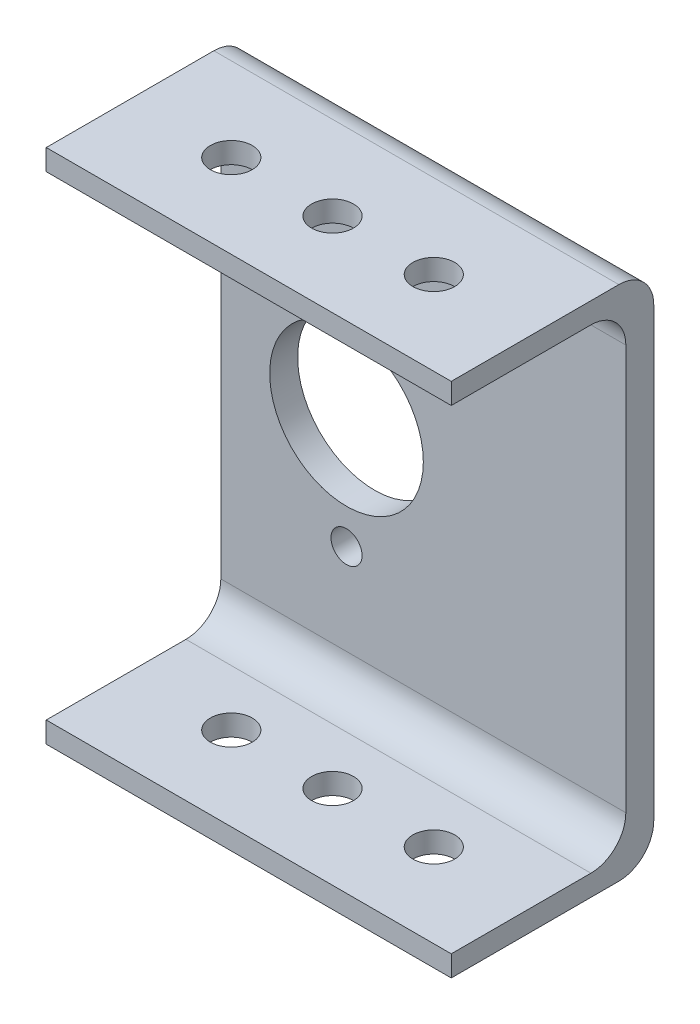
ISO-10303-21;
HEADER;
FILE_DESCRIPTION(('STEP AP214'),'2;1');
FILE_NAME('part.step','',(''),(''),'','','');
FILE_SCHEMA(('AUTOMOTIVE_DESIGN { 1 0 10303 214 1 1 1 1 }'));
ENDSEC;
DATA;
#1=APPLICATION_CONTEXT('core data for automotive mechanical design processes');
#2=APPLICATION_PROTOCOL_DEFINITION('international standard','automotive_design',2000,#1);
#3=PRODUCT_CONTEXT('',#1,'mechanical');
#4=PRODUCT('Part','Part','',(#3));
#5=PRODUCT_RELATED_PRODUCT_CATEGORY('part','',(#4));
#6=PRODUCT_DEFINITION_FORMATION('','',#4);
#7=PRODUCT_DEFINITION_CONTEXT('part definition',#1,'design');
#8=PRODUCT_DEFINITION('design','',#6,#7);
#9=PRODUCT_DEFINITION_SHAPE('','',#8);
#10=(LENGTH_UNIT() NAMED_UNIT(*) SI_UNIT(.MILLI.,.METRE.));
#11=(NAMED_UNIT(*) PLANE_ANGLE_UNIT() SI_UNIT($,.RADIAN.));
#12=(NAMED_UNIT(*) SI_UNIT($,.STERADIAN.) SOLID_ANGLE_UNIT());
#13=UNCERTAINTY_MEASURE_WITH_UNIT(LENGTH_MEASURE(1.E-05),#10,'distance_accuracy_value','');
#14=(GEOMETRIC_REPRESENTATION_CONTEXT(3) GLOBAL_UNCERTAINTY_ASSIGNED_CONTEXT((#13)) GLOBAL_UNIT_ASSIGNED_CONTEXT((#10,
#11,#12)) REPRESENTATION_CONTEXT('',''));
#15=CARTESIAN_POINT('',(0.,0.,0.));
#16=DIRECTION('',(0.,0.,1.));
#17=DIRECTION('',(1.,0.,0.));
#18=AXIS2_PLACEMENT_3D('',#15,#16,#17);
#19=CARTESIAN_POINT('',(0.,0.,4.));
#20=DIRECTION('',(0.,0.,-1.));
#21=DIRECTION('',(-1.,0.,0.));
#22=AXIS2_PLACEMENT_3D('',#19,#20,#21);
#23=PLANE('',#22);
#24=CARTESIAN_POINT('',(-1.00000000000013,-15.9999999999998,4.));
#25=DIRECTION('',(0.,0.,-1.));
#26=DIRECTION('',(-1.,0.,0.));
#27=AXIS2_PLACEMENT_3D('',#24,#25,#26);
#28=CIRCLE('',#27,2.22499999999983);
#29=CARTESIAN_POINT('',(-3.22499999999996,-15.9999999999998,4.));
#30=VERTEX_POINT('',#29);
#31=EDGE_CURVE('E335',#30,#30,#28,.T.);
#32=ORIENTED_EDGE('',*,*,#31,.T.);
#33=EDGE_LOOP('',(#32));
#34=FACE_BOUND('',#33,.T.);
#35=CARTESIAN_POINT('',(-1.0000000000001,16.0000000000002,4.));
#36=DIRECTION('',(0.,0.,-1.));
#37=DIRECTION('',(-1.,0.,0.));
#38=AXIS2_PLACEMENT_3D('',#35,#36,#37);
#39=CIRCLE('',#38,2.22499999999983);
#40=CARTESIAN_POINT('',(-3.22499999999993,16.0000000000002,4.));
#41=VERTEX_POINT('',#40);
#42=EDGE_CURVE('E337',#41,#41,#39,.T.);
#43=ORIENTED_EDGE('',*,*,#42,.T.);
#44=EDGE_LOOP('',(#43));
#45=FACE_BOUND('',#44,.T.);
#46=CARTESIAN_POINT('',(-1.00000000000022,2.22044604925031E-13,4.));
#47=DIRECTION('',(0.,0.,1.));
#48=DIRECTION('',(1.,0.,0.));
#49=AXIS2_PLACEMENT_3D('',#46,#47,#48);
#50=CIRCLE('',#49,11.);
#51=CARTESIAN_POINT('',(9.99999999999977,2.22044604925031E-13,4.));
#52=VERTEX_POINT('',#51);
#53=EDGE_CURVE('E162',#52,#52,#50,.T.);
#54=ORIENTED_EDGE('',*,*,#53,.F.);
#55=EDGE_LOOP('',(#54));
#56=FACE_BOUND('',#55,.T.);
#57=DIRECTION('',(0.,-1.,0.));
#58=VECTOR('',#57,1.);
#59=CARTESIAN_POINT('',(-19.,37.,4.));
#60=LINE('',#59,#58);
#61=CARTESIAN_POINT('',(-19.,29.,4.));
#62=VERTEX_POINT('',#61);
#63=CARTESIAN_POINT('',(-19.,-29.,4.));
#64=VERTEX_POINT('',#63);
#65=EDGE_CURVE('E190',#62,#64,#60,.T.);
#66=ORIENTED_EDGE('',*,*,#65,.T.);
#67=DIRECTION('',(-1.,0.,0.));
#68=VECTOR('',#67,1.);
#69=CARTESIAN_POINT('',(39.,-29.,4.));
#70=LINE('',#69,#68);
#71=CARTESIAN_POINT('',(39.,-29.,4.));
#72=VERTEX_POINT('',#71);
#73=EDGE_CURVE('E213',#64,#72,#70,.F.);
#74=ORIENTED_EDGE('',*,*,#73,.T.);
#75=DIRECTION('',(0.,1.,0.));
#76=VECTOR('',#75,1.);
#77=CARTESIAN_POINT('',(39.,0.,4.));
#78=LINE('',#77,#76);
#79=CARTESIAN_POINT('',(39.,29.,4.));
#80=VERTEX_POINT('',#79);
#81=EDGE_CURVE('E187',#72,#80,#78,.T.);
#82=ORIENTED_EDGE('',*,*,#81,.T.);
#83=DIRECTION('',(1.,0.,0.));
#84=VECTOR('',#83,1.);
#85=CARTESIAN_POINT('',(-19.,29.,4.));
#86=LINE('',#85,#84);
#87=EDGE_CURVE('E211',#80,#62,#86,.F.);
#88=ORIENTED_EDGE('',*,*,#87,.T.);
#89=EDGE_LOOP('',(#66,#74,#82,#88));
#90=FACE_BOUND('',#89,.T.);
#91=ADVANCED_FACE('F39',(#34,#45,#56,#90),#23,.F.);
#92=CARTESIAN_POINT('',(0.,0.,0.));
#93=DIRECTION('',(0.,0.,-1.));
#94=DIRECTION('',(-1.,0.,0.));
#95=AXIS2_PLACEMENT_3D('',#92,#93,#94);
#96=PLANE('',#95);
#97=CARTESIAN_POINT('',(-1.00000000000013,-15.9999999999998,0.));
#98=DIRECTION('',(0.,0.,-1.));
#99=DIRECTION('',(-1.,0.,0.));
#100=AXIS2_PLACEMENT_3D('',#97,#98,#99);
#101=CIRCLE('',#100,2.22499999999983);
#102=CARTESIAN_POINT('',(-3.22499999999996,-15.9999999999998,0.));
#103=VERTEX_POINT('',#102);
#104=EDGE_CURVE('E341',#103,#103,#101,.T.);
#105=ORIENTED_EDGE('',*,*,#104,.F.);
#106=EDGE_LOOP('',(#105));
#107=FACE_BOUND('',#106,.T.);
#108=CARTESIAN_POINT('',(-1.0000000000001,16.0000000000002,0.));
#109=DIRECTION('',(0.,0.,-1.));
#110=DIRECTION('',(-1.,0.,0.));
#111=AXIS2_PLACEMENT_3D('',#108,#109,#110);
#112=CIRCLE('',#111,2.22499999999983);
#113=CARTESIAN_POINT('',(-3.22499999999993,16.0000000000002,0.));
#114=VERTEX_POINT('',#113);
#115=EDGE_CURVE('E419',#114,#114,#112,.T.);
#116=ORIENTED_EDGE('',*,*,#115,.F.);
#117=EDGE_LOOP('',(#116));
#118=FACE_BOUND('',#117,.T.);
#119=DIRECTION('',(0.,-1.,0.));
#120=VECTOR('',#119,1.);
#121=CARTESIAN_POINT('',(-19.,0.,0.));
#122=LINE('',#121,#120);
#123=CARTESIAN_POINT('',(-19.,32.,0.));
#124=VERTEX_POINT('',#123);
#125=CARTESIAN_POINT('',(-19.,-32.,0.));
#126=VERTEX_POINT('',#125);
#127=EDGE_CURVE('E185',#124,#126,#122,.T.);
#128=ORIENTED_EDGE('',*,*,#127,.F.);
#129=DIRECTION('',(-1.,0.,0.));
#130=VECTOR('',#129,1.);
#131=CARTESIAN_POINT('',(39.,32.,0.));
#132=LINE('',#131,#130);
#133=CARTESIAN_POINT('',(39.,32.,0.));
#134=VERTEX_POINT('',#133);
#135=EDGE_CURVE('E64',#124,#134,#132,.F.);
#136=ORIENTED_EDGE('',*,*,#135,.T.);
#137=DIRECTION('',(0.,1.,0.));
#138=VECTOR('',#137,1.);
#139=CARTESIAN_POINT('',(39.,-37.,0.));
#140=LINE('',#139,#138);
#141=CARTESIAN_POINT('',(39.,-32.,0.));
#142=VERTEX_POINT('',#141);
#143=EDGE_CURVE('E191',#142,#134,#140,.T.);
#144=ORIENTED_EDGE('',*,*,#143,.F.);
#145=DIRECTION('',(1.,0.,0.));
#146=VECTOR('',#145,1.);
#147=CARTESIAN_POINT('',(-19.,-32.,0.));
#148=LINE('',#147,#146);
#149=EDGE_CURVE('E224',#142,#126,#148,.F.);
#150=ORIENTED_EDGE('',*,*,#149,.T.);
#151=EDGE_LOOP('',(#128,#136,#144,#150));
#152=FACE_BOUND('',#151,.T.);
#153=CARTESIAN_POINT('',(-1.00000000000022,2.22044604925031E-13,0.));
#154=DIRECTION('',(0.,0.,1.));
#155=DIRECTION('',(1.,0.,0.));
#156=AXIS2_PLACEMENT_3D('',#153,#154,#155);
#157=CIRCLE('',#156,11.);
#158=CARTESIAN_POINT('',(9.99999999999977,2.22044604925031E-13,0.));
#159=VERTEX_POINT('',#158);
#160=EDGE_CURVE('E159',#159,#159,#157,.T.);
#161=ORIENTED_EDGE('',*,*,#160,.T.);
#162=EDGE_LOOP('',(#161));
#163=FACE_BOUND('',#162,.T.);
#164=ADVANCED_FACE('F264',(#107,#118,#152,#163),#96,.T.);
#165=CARTESIAN_POINT('',(-19.,37.,4.));
#166=DIRECTION('',(0.,-1.,0.));
#167=DIRECTION('',(1.,0.,0.));
#168=AXIS2_PLACEMENT_3D('',#165,#166,#167);
#169=PLANE('',#168);
#170=CARTESIAN_POINT('',(24.5,37.,17.));
#171=DIRECTION('',(0.,-1.,0.));
#172=DIRECTION('',(0.,0.,-1.));
#173=AXIS2_PLACEMENT_3D('',#170,#171,#172);
#174=CIRCLE('',#173,3.);
#175=CARTESIAN_POINT('',(24.5,37.,14.));
#176=VERTEX_POINT('',#175);
#177=EDGE_CURVE('E240',#176,#176,#174,.T.);
#178=ORIENTED_EDGE('',*,*,#177,.T.);
#179=EDGE_LOOP('',(#178));
#180=FACE_BOUND('',#179,.T.);
#181=CARTESIAN_POINT('',(-4.50000000000002,37.,17.));
#182=DIRECTION('',(0.,-1.,0.));
#183=DIRECTION('',(0.,0.,-1.));
#184=AXIS2_PLACEMENT_3D('',#181,#182,#183);
#185=CIRCLE('',#184,3.);
#186=CARTESIAN_POINT('',(-4.50000000000002,37.,14.));
#187=VERTEX_POINT('',#186);
#188=EDGE_CURVE('E330',#187,#187,#185,.T.);
#189=ORIENTED_EDGE('',*,*,#188,.T.);
#190=EDGE_LOOP('',(#189));
#191=FACE_BOUND('',#190,.T.);
#192=CARTESIAN_POINT('',(9.99999999999997,37.,17.));
#193=DIRECTION('',(0.,-1.,0.));
#194=DIRECTION('',(0.,0.,-1.));
#195=AXIS2_PLACEMENT_3D('',#192,#193,#194);
#196=CIRCLE('',#195,3.);
#197=CARTESIAN_POINT('',(9.99999999999997,37.,14.));
#198=VERTEX_POINT('',#197);
#199=EDGE_CURVE('E253',#198,#198,#196,.T.);
#200=ORIENTED_EDGE('',*,*,#199,.T.);
#201=EDGE_LOOP('',(#200));
#202=FACE_BOUND('',#201,.T.);
#203=DIRECTION('',(0.,0.,-1.));
#204=VECTOR('',#203,1.);
#205=CARTESIAN_POINT('',(39.,37.,4.));
#206=LINE('',#205,#204);
#207=CARTESIAN_POINT('',(39.,37.,29.));
#208=VERTEX_POINT('',#207);
#209=CARTESIAN_POINT('',(39.,37.,5.));
#210=VERTEX_POINT('',#209);
#211=EDGE_CURVE('E205',#208,#210,#206,.T.);
#212=ORIENTED_EDGE('',*,*,#211,.T.);
#213=DIRECTION('',(-1.,0.,0.));
#214=VECTOR('',#213,1.);
#215=CARTESIAN_POINT('',(-19.,37.,5.));
#216=LINE('',#215,#214);
#217=CARTESIAN_POINT('',(-19.,37.,5.));
#218=VERTEX_POINT('',#217);
#219=EDGE_CURVE('E217',#210,#218,#216,.T.);
#220=ORIENTED_EDGE('',*,*,#219,.T.);
#221=DIRECTION('',(0.,0.,-1.));
#222=VECTOR('',#221,1.);
#223=CARTESIAN_POINT('',(-19.,37.,4.));
#224=LINE('',#223,#222);
#225=CARTESIAN_POINT('',(-19.,37.,29.));
#226=VERTEX_POINT('',#225);
#227=EDGE_CURVE('E203',#226,#218,#224,.T.);
#228=ORIENTED_EDGE('',*,*,#227,.F.);
#229=DIRECTION('',(-1.,0.,0.));
#230=VECTOR('',#229,1.);
#231=CARTESIAN_POINT('',(-19.,37.,29.));
#232=LINE('',#231,#230);
#233=EDGE_CURVE('E151',#208,#226,#232,.T.);
#234=ORIENTED_EDGE('',*,*,#233,.F.);
#235=EDGE_LOOP('',(#212,#220,#228,#234));
#236=FACE_BOUND('',#235,.T.);
#237=ADVANCED_FACE('F260',(#180,#191,#202,#236),#169,.F.);
#238=CARTESIAN_POINT('',(-19.,0.,4.));
#239=DIRECTION('',(1.,0.,0.));
#240=DIRECTION('',(0.,0.,-1.));
#241=AXIS2_PLACEMENT_3D('',#238,#239,#240);
#242=PLANE('',#241);
#243=ORIENTED_EDGE('',*,*,#227,.T.);
#244=CARTESIAN_POINT('',(-19.,32.,5.));
#245=DIRECTION('',(1.,0.,0.));
#246=DIRECTION('',(0.,0.,-1.));
#247=AXIS2_PLACEMENT_3D('',#244,#245,#246);
#248=CIRCLE('',#247,5.);
#249=EDGE_CURVE('E222',#218,#124,#248,.F.);
#250=ORIENTED_EDGE('',*,*,#249,.T.);
#251=ORIENTED_EDGE('',*,*,#127,.T.);
#252=CARTESIAN_POINT('',(-19.,-32.,5.));
#253=DIRECTION('',(1.,0.,0.));
#254=DIRECTION('',(0.,0.,-1.));
#255=AXIS2_PLACEMENT_3D('',#252,#253,#254);
#256=CIRCLE('',#255,5.);
#257=CARTESIAN_POINT('',(-19.,-37.,5.));
#258=VERTEX_POINT('',#257);
#259=EDGE_CURVE('E220',#126,#258,#256,.F.);
#260=ORIENTED_EDGE('',*,*,#259,.T.);
#261=DIRECTION('',(0.,0.,-1.));
#262=VECTOR('',#261,1.);
#263=CARTESIAN_POINT('',(-19.,-37.,4.));
#264=LINE('',#263,#262);
#265=CARTESIAN_POINT('',(-19.,-37.,29.));
#266=VERTEX_POINT('',#265);
#267=EDGE_CURVE('E200',#266,#258,#264,.T.);
#268=ORIENTED_EDGE('',*,*,#267,.F.);
#269=DIRECTION('',(0.,-1.,0.));
#270=VECTOR('',#269,1.);
#271=CARTESIAN_POINT('',(-19.,-37.,29.));
#272=LINE('',#271,#270);
#273=CARTESIAN_POINT('',(-19.,-34.,29.));
#274=VERTEX_POINT('',#273);
#275=EDGE_CURVE('E177',#274,#266,#272,.T.);
#276=ORIENTED_EDGE('',*,*,#275,.F.);
#277=DIRECTION('',(0.,0.,-1.));
#278=VECTOR('',#277,1.);
#279=CARTESIAN_POINT('',(-19.,-34.,29.));
#280=LINE('',#279,#278);
#281=CARTESIAN_POINT('',(-19.,-34.,9.));
#282=VERTEX_POINT('',#281);
#283=EDGE_CURVE('E170',#274,#282,#280,.T.);
#284=ORIENTED_EDGE('',*,*,#283,.T.);
#285=CARTESIAN_POINT('',(-19.,-29.,9.));
#286=DIRECTION('',(1.,0.,0.));
#287=DIRECTION('',(0.,0.,-1.));
#288=AXIS2_PLACEMENT_3D('',#285,#286,#287);
#289=CIRCLE('',#288,5.);
#290=EDGE_CURVE('E232',#282,#64,#289,.T.);
#291=ORIENTED_EDGE('',*,*,#290,.T.);
#292=ORIENTED_EDGE('',*,*,#65,.F.);
#293=CARTESIAN_POINT('',(-19.,29.,9.));
#294=DIRECTION('',(1.,0.,0.));
#295=DIRECTION('',(0.,0.,-1.));
#296=AXIS2_PLACEMENT_3D('',#293,#294,#295);
#297=CIRCLE('',#296,5.);
#298=CARTESIAN_POINT('',(-19.,34.,9.));
#299=VERTEX_POINT('',#298);
#300=EDGE_CURVE('E11',#62,#299,#297,.T.);
#301=ORIENTED_EDGE('',*,*,#300,.T.);
#302=DIRECTION('',(0.,0.,-1.));
#303=VECTOR('',#302,1.);
#304=CARTESIAN_POINT('',(-19.,34.,29.));
#305=LINE('',#304,#303);
#306=CARTESIAN_POINT('',(-19.,34.,29.));
#307=VERTEX_POINT('',#306);
#308=EDGE_CURVE('E137',#307,#299,#305,.T.);
#309=ORIENTED_EDGE('',*,*,#308,.F.);
#310=DIRECTION('',(0.,-1.,0.));
#311=VECTOR('',#310,1.);
#312=CARTESIAN_POINT('',(-19.,37.,29.));
#313=LINE('',#312,#311);
#314=EDGE_CURVE('E145',#226,#307,#313,.T.);
#315=ORIENTED_EDGE('',*,*,#314,.F.);
#316=EDGE_LOOP('',(#243,#250,#251,#260,#268,#276,#284,#291,#292,#301,#309,#315));
#317=FACE_BOUND('',#316,.T.);
#318=ADVANCED_FACE('F156',(#317),#242,.F.);
#319=CARTESIAN_POINT('',(-19.,-37.,4.));
#320=DIRECTION('',(0.,1.,0.));
#321=DIRECTION('',(0.,0.,1.));
#322=AXIS2_PLACEMENT_3D('',#319,#320,#321);
#323=PLANE('',#322);
#324=CARTESIAN_POINT('',(24.5,-37.,17.));
#325=DIRECTION('',(0.,-1.,0.));
#326=DIRECTION('',(0.,0.,-1.));
#327=AXIS2_PLACEMENT_3D('',#324,#325,#326);
#328=CIRCLE('',#327,3.);
#329=CARTESIAN_POINT('',(24.5,-37.,14.));
#330=VERTEX_POINT('',#329);
#331=EDGE_CURVE('E346',#330,#330,#328,.T.);
#332=ORIENTED_EDGE('',*,*,#331,.F.);
#333=EDGE_LOOP('',(#332));
#334=FACE_BOUND('',#333,.T.);
#335=CARTESIAN_POINT('',(-4.50000000000002,-37.,17.));
#336=DIRECTION('',(0.,-1.,0.));
#337=DIRECTION('',(0.,0.,-1.));
#338=AXIS2_PLACEMENT_3D('',#335,#336,#337);
#339=CIRCLE('',#338,3.);
#340=CARTESIAN_POINT('',(-4.50000000000002,-37.,14.));
#341=VERTEX_POINT('',#340);
#342=EDGE_CURVE('E349',#341,#341,#339,.T.);
#343=ORIENTED_EDGE('',*,*,#342,.F.);
#344=EDGE_LOOP('',(#343));
#345=FACE_BOUND('',#344,.T.);
#346=CARTESIAN_POINT('',(9.99999999999997,-37.,17.));
#347=DIRECTION('',(0.,-1.,0.));
#348=DIRECTION('',(0.,0.,-1.));
#349=AXIS2_PLACEMENT_3D('',#346,#347,#348);
#350=CIRCLE('',#349,3.);
#351=CARTESIAN_POINT('',(9.99999999999997,-37.,14.));
#352=VERTEX_POINT('',#351);
#353=EDGE_CURVE('E334',#352,#352,#350,.T.);
#354=ORIENTED_EDGE('',*,*,#353,.F.);
#355=EDGE_LOOP('',(#354));
#356=FACE_BOUND('',#355,.T.);
#357=ORIENTED_EDGE('',*,*,#267,.T.);
#358=DIRECTION('',(1.,0.,0.));
#359=VECTOR('',#358,1.);
#360=CARTESIAN_POINT('',(39.,-37.,5.));
#361=LINE('',#360,#359);
#362=CARTESIAN_POINT('',(39.,-37.,5.));
#363=VERTEX_POINT('',#362);
#364=EDGE_CURVE('E230',#258,#363,#361,.T.);
#365=ORIENTED_EDGE('',*,*,#364,.T.);
#366=DIRECTION('',(0.,0.,-1.));
#367=VECTOR('',#366,1.);
#368=CARTESIAN_POINT('',(39.,-37.,4.));
#369=LINE('',#368,#367);
#370=CARTESIAN_POINT('',(39.,-37.,29.));
#371=VERTEX_POINT('',#370);
#372=EDGE_CURVE('E194',#371,#363,#369,.T.);
#373=ORIENTED_EDGE('',*,*,#372,.F.);
#374=DIRECTION('',(1.,0.,0.));
#375=VECTOR('',#374,1.);
#376=CARTESIAN_POINT('',(39.,-37.,29.));
#377=LINE('',#376,#375);
#378=EDGE_CURVE('E174',#266,#371,#377,.T.);
#379=ORIENTED_EDGE('',*,*,#378,.F.);
#380=EDGE_LOOP('',(#357,#365,#373,#379));
#381=FACE_BOUND('',#380,.T.);
#382=ADVANCED_FACE('F272',(#334,#345,#356,#381),#323,.F.);
#383=CARTESIAN_POINT('',(39.,-37.,4.));
#384=DIRECTION('',(-1.,0.,0.));
#385=DIRECTION('',(0.,0.,1.));
#386=AXIS2_PLACEMENT_3D('',#383,#384,#385);
#387=PLANE('',#386);
#388=ORIENTED_EDGE('',*,*,#143,.T.);
#389=CARTESIAN_POINT('',(39.,32.,5.));
#390=DIRECTION('',(-1.,0.,0.));
#391=DIRECTION('',(0.,0.,1.));
#392=AXIS2_PLACEMENT_3D('',#389,#390,#391);
#393=CIRCLE('',#392,5.);
#394=EDGE_CURVE('E228',#134,#210,#393,.F.);
#395=ORIENTED_EDGE('',*,*,#394,.T.);
#396=ORIENTED_EDGE('',*,*,#211,.F.);
#397=DIRECTION('',(0.,1.,0.));
#398=VECTOR('',#397,1.);
#399=CARTESIAN_POINT('',(39.,37.,29.));
#400=LINE('',#399,#398);
#401=CARTESIAN_POINT('',(39.,34.,29.));
#402=VERTEX_POINT('',#401);
#403=EDGE_CURVE('E144',#402,#208,#400,.T.);
#404=ORIENTED_EDGE('',*,*,#403,.F.);
#405=DIRECTION('',(0.,0.,-1.));
#406=VECTOR('',#405,1.);
#407=CARTESIAN_POINT('',(39.,34.,29.));
#408=LINE('',#407,#406);
#409=CARTESIAN_POINT('',(39.,34.,9.));
#410=VERTEX_POINT('',#409);
#411=EDGE_CURVE('E140',#402,#410,#408,.T.);
#412=ORIENTED_EDGE('',*,*,#411,.T.);
#413=CARTESIAN_POINT('',(39.,29.,9.));
#414=DIRECTION('',(-1.,0.,0.));
#415=DIRECTION('',(0.,0.,1.));
#416=AXIS2_PLACEMENT_3D('',#413,#414,#415);
#417=CIRCLE('',#416,5.);
#418=EDGE_CURVE('E48',#410,#80,#417,.T.);
#419=ORIENTED_EDGE('',*,*,#418,.T.);
#420=ORIENTED_EDGE('',*,*,#81,.F.);
#421=CARTESIAN_POINT('',(39.,-29.,9.));
#422=DIRECTION('',(-1.,0.,0.));
#423=DIRECTION('',(0.,0.,1.));
#424=AXIS2_PLACEMENT_3D('',#421,#422,#423);
#425=CIRCLE('',#424,5.);
#426=CARTESIAN_POINT('',(39.,-34.,9.));
#427=VERTEX_POINT('',#426);
#428=EDGE_CURVE('E234',#72,#427,#425,.T.);
#429=ORIENTED_EDGE('',*,*,#428,.T.);
#430=DIRECTION('',(0.,0.,-1.));
#431=VECTOR('',#430,1.);
#432=CARTESIAN_POINT('',(39.,-34.,29.));
#433=LINE('',#432,#431);
#434=CARTESIAN_POINT('',(39.,-34.,29.));
#435=VERTEX_POINT('',#434);
#436=EDGE_CURVE('E167',#435,#427,#433,.T.);
#437=ORIENTED_EDGE('',*,*,#436,.F.);
#438=DIRECTION('',(0.,1.,0.));
#439=VECTOR('',#438,1.);
#440=CARTESIAN_POINT('',(39.,-37.,29.));
#441=LINE('',#440,#439);
#442=EDGE_CURVE('E154',#371,#435,#441,.T.);
#443=ORIENTED_EDGE('',*,*,#442,.F.);
#444=ORIENTED_EDGE('',*,*,#372,.T.);
#445=CARTESIAN_POINT('',(39.,-32.,5.));
#446=DIRECTION('',(-1.,0.,0.));
#447=DIRECTION('',(0.,0.,1.));
#448=AXIS2_PLACEMENT_3D('',#445,#446,#447);
#449=CIRCLE('',#448,5.);
#450=EDGE_CURVE('E56',#363,#142,#449,.F.);
#451=ORIENTED_EDGE('',*,*,#450,.T.);
#452=EDGE_LOOP('',(#388,#395,#396,#404,#412,#419,#420,#429,#437,#443,#444,#451));
#453=FACE_BOUND('',#452,.T.);
#454=ADVANCED_FACE('F268',(#453),#387,.F.);
#455=CARTESIAN_POINT('',(-1.00000000000022,2.22044604925031E-13,4.));
#456=DIRECTION('',(0.,0.,-1.));
#457=DIRECTION('',(-1.,0.,0.));
#458=AXIS2_PLACEMENT_3D('',#455,#456,#457);
#459=CYLINDRICAL_SURFACE('',#458,11.);
#460=ORIENTED_EDGE('',*,*,#53,.T.);
#461=EDGE_LOOP('',(#460));
#462=FACE_BOUND('',#461,.T.);
#463=ORIENTED_EDGE('',*,*,#160,.F.);
#464=EDGE_LOOP('',(#463));
#465=FACE_BOUND('',#464,.T.);
#466=ADVANCED_FACE('F309',(#462,#465),#459,.F.);
#467=CARTESIAN_POINT('',(39.,-34.,29.));
#468=DIRECTION('',(0.,-1.,0.));
#469=DIRECTION('',(0.,0.,-1.));
#470=AXIS2_PLACEMENT_3D('',#467,#468,#469);
#471=PLANE('',#470);
#472=CARTESIAN_POINT('',(24.5,-34.,17.));
#473=DIRECTION('',(0.,-1.,0.));
#474=DIRECTION('',(0.,0.,-1.));
#475=AXIS2_PLACEMENT_3D('',#472,#473,#474);
#476=CIRCLE('',#475,3.);
#477=CARTESIAN_POINT('',(24.5,-34.,14.));
#478=VERTEX_POINT('',#477);
#479=EDGE_CURVE('E171',#478,#478,#476,.T.);
#480=ORIENTED_EDGE('',*,*,#479,.T.);
#481=EDGE_LOOP('',(#480));
#482=FACE_BOUND('',#481,.T.);
#483=CARTESIAN_POINT('',(-4.50000000000002,-34.,17.));
#484=DIRECTION('',(0.,-1.,0.));
#485=DIRECTION('',(0.,0.,-1.));
#486=AXIS2_PLACEMENT_3D('',#483,#484,#485);
#487=CIRCLE('',#486,3.);
#488=CARTESIAN_POINT('',(-4.50000000000002,-34.,14.));
#489=VERTEX_POINT('',#488);
#490=EDGE_CURVE('E243',#489,#489,#487,.T.);
#491=ORIENTED_EDGE('',*,*,#490,.T.);
#492=EDGE_LOOP('',(#491));
#493=FACE_BOUND('',#492,.T.);
#494=CARTESIAN_POINT('',(9.99999999999997,-34.,17.));
#495=DIRECTION('',(0.,-1.,0.));
#496=DIRECTION('',(0.,0.,-1.));
#497=AXIS2_PLACEMENT_3D('',#494,#495,#496);
#498=CIRCLE('',#497,3.);
#499=CARTESIAN_POINT('',(9.99999999999997,-34.,14.));
#500=VERTEX_POINT('',#499);
#501=EDGE_CURVE('E239',#500,#500,#498,.T.);
#502=ORIENTED_EDGE('',*,*,#501,.T.);
#503=EDGE_LOOP('',(#502));
#504=FACE_BOUND('',#503,.T.);
#505=ORIENTED_EDGE('',*,*,#436,.T.);
#506=DIRECTION('',(-1.,0.,0.));
#507=VECTOR('',#506,1.);
#508=CARTESIAN_POINT('',(-19.,-34.,9.));
#509=LINE('',#508,#507);
#510=EDGE_CURVE('E208',#427,#282,#509,.T.);
#511=ORIENTED_EDGE('',*,*,#510,.T.);
#512=ORIENTED_EDGE('',*,*,#283,.F.);
#513=DIRECTION('',(-1.,0.,0.));
#514=VECTOR('',#513,1.);
#515=CARTESIAN_POINT('',(39.,-34.,29.));
#516=LINE('',#515,#514);
#517=EDGE_CURVE('E180',#435,#274,#516,.T.);
#518=ORIENTED_EDGE('',*,*,#517,.F.);
#519=EDGE_LOOP('',(#505,#511,#512,#518));
#520=FACE_BOUND('',#519,.T.);
#521=ADVANCED_FACE('F281',(#482,#493,#504,#520),#471,.F.);
#522=CARTESIAN_POINT('',(0.,0.,29.));
#523=DIRECTION('',(0.,0.,1.));
#524=DIRECTION('',(1.,0.,0.));
#525=AXIS2_PLACEMENT_3D('',#522,#523,#524);
#526=PLANE('',#525);
#527=ORIENTED_EDGE('',*,*,#442,.T.);
#528=ORIENTED_EDGE('',*,*,#517,.T.);
#529=ORIENTED_EDGE('',*,*,#275,.T.);
#530=ORIENTED_EDGE('',*,*,#378,.T.);
#531=EDGE_LOOP('',(#527,#528,#529,#530));
#532=FACE_BOUND('',#531,.T.);
#533=ADVANCED_FACE('F275',(#532),#526,.T.);
#534=CARTESIAN_POINT('',(-19.,34.,29.));
#535=DIRECTION('',(0.,1.,0.));
#536=DIRECTION('',(0.,0.,1.));
#537=AXIS2_PLACEMENT_3D('',#534,#535,#536);
#538=PLANE('',#537);
#539=CARTESIAN_POINT('',(24.5,34.,17.));
#540=DIRECTION('',(0.,1.,0.));
#541=DIRECTION('',(0.,0.,1.));
#542=AXIS2_PLACEMENT_3D('',#539,#540,#541);
#543=CIRCLE('',#542,3.);
#544=CARTESIAN_POINT('',(24.5,34.,20.));
#545=VERTEX_POINT('',#544);
#546=EDGE_CURVE('E43',#545,#545,#543,.T.);
#547=ORIENTED_EDGE('',*,*,#546,.T.);
#548=EDGE_LOOP('',(#547));
#549=FACE_BOUND('',#548,.T.);
#550=CARTESIAN_POINT('',(-4.50000000000002,34.,17.));
#551=DIRECTION('',(0.,1.,0.));
#552=DIRECTION('',(0.,0.,1.));
#553=AXIS2_PLACEMENT_3D('',#550,#551,#552);
#554=CIRCLE('',#553,3.);
#555=CARTESIAN_POINT('',(-4.50000000000002,34.,20.));
#556=VERTEX_POINT('',#555);
#557=EDGE_CURVE('E241',#556,#556,#554,.T.);
#558=ORIENTED_EDGE('',*,*,#557,.T.);
#559=EDGE_LOOP('',(#558));
#560=FACE_BOUND('',#559,.T.);
#561=CARTESIAN_POINT('',(9.99999999999997,34.,17.));
#562=DIRECTION('',(0.,1.,0.));
#563=DIRECTION('',(0.,0.,1.));
#564=AXIS2_PLACEMENT_3D('',#561,#562,#563);
#565=CIRCLE('',#564,3.);
#566=CARTESIAN_POINT('',(9.99999999999997,34.,20.));
#567=VERTEX_POINT('',#566);
#568=EDGE_CURVE('E237',#567,#567,#565,.T.);
#569=ORIENTED_EDGE('',*,*,#568,.T.);
#570=EDGE_LOOP('',(#569));
#571=FACE_BOUND('',#570,.T.);
#572=ORIENTED_EDGE('',*,*,#308,.T.);
#573=DIRECTION('',(1.,0.,0.));
#574=VECTOR('',#573,1.);
#575=CARTESIAN_POINT('',(39.,34.,9.));
#576=LINE('',#575,#574);
#577=EDGE_CURVE('E215',#299,#410,#576,.T.);
#578=ORIENTED_EDGE('',*,*,#577,.T.);
#579=ORIENTED_EDGE('',*,*,#411,.F.);
#580=DIRECTION('',(1.,0.,0.));
#581=VECTOR('',#580,1.);
#582=CARTESIAN_POINT('',(-19.,34.,29.));
#583=LINE('',#582,#581);
#584=EDGE_CURVE('E132',#307,#402,#583,.T.);
#585=ORIENTED_EDGE('',*,*,#584,.F.);
#586=EDGE_LOOP('',(#572,#578,#579,#585));
#587=FACE_BOUND('',#586,.T.);
#588=ADVANCED_FACE('F134',(#549,#560,#571,#587),#538,.F.);
#589=CARTESIAN_POINT('',(0.,0.,29.));
#590=DIRECTION('',(0.,0.,1.));
#591=DIRECTION('',(1.,0.,0.));
#592=AXIS2_PLACEMENT_3D('',#589,#590,#591);
#593=PLANE('',#592);
#594=ORIENTED_EDGE('',*,*,#314,.T.);
#595=ORIENTED_EDGE('',*,*,#584,.T.);
#596=ORIENTED_EDGE('',*,*,#403,.T.);
#597=ORIENTED_EDGE('',*,*,#233,.T.);
#598=EDGE_LOOP('',(#594,#595,#596,#597));
#599=FACE_BOUND('',#598,.T.);
#600=ADVANCED_FACE('F149',(#599),#593,.T.);
#601=CARTESIAN_POINT('',(39.,-29.,9.));
#602=DIRECTION('',(1.,0.,0.));
#603=DIRECTION('',(0.,0.,-1.));
#604=AXIS2_PLACEMENT_3D('',#601,#602,#603);
#605=CYLINDRICAL_SURFACE('',#604,5.);
#606=ORIENTED_EDGE('',*,*,#428,.F.);
#607=ORIENTED_EDGE('',*,*,#73,.F.);
#608=ORIENTED_EDGE('',*,*,#290,.F.);
#609=ORIENTED_EDGE('',*,*,#510,.F.);
#610=EDGE_LOOP('',(#606,#607,#608,#609));
#611=FACE_BOUND('',#610,.T.);
#612=ADVANCED_FACE('F284',(#611),#605,.F.);
#613=CARTESIAN_POINT('',(-19.,29.,9.));
#614=DIRECTION('',(-1.,0.,0.));
#615=DIRECTION('',(0.,0.,1.));
#616=AXIS2_PLACEMENT_3D('',#613,#614,#615);
#617=CYLINDRICAL_SURFACE('',#616,5.);
#618=ORIENTED_EDGE('',*,*,#300,.F.);
#619=ORIENTED_EDGE('',*,*,#87,.F.);
#620=ORIENTED_EDGE('',*,*,#418,.F.);
#621=ORIENTED_EDGE('',*,*,#577,.F.);
#622=EDGE_LOOP('',(#618,#619,#620,#621));
#623=FACE_BOUND('',#622,.T.);
#624=ADVANCED_FACE('F289',(#623),#617,.F.);
#625=CARTESIAN_POINT('',(-19.,32.,5.));
#626=DIRECTION('',(1.,0.,0.));
#627=DIRECTION('',(0.,1.,0.));
#628=AXIS2_PLACEMENT_3D('',#625,#626,#627);
#629=CYLINDRICAL_SURFACE('',#628,5.);
#630=ORIENTED_EDGE('',*,*,#394,.F.);
#631=ORIENTED_EDGE('',*,*,#135,.F.);
#632=ORIENTED_EDGE('',*,*,#249,.F.);
#633=ORIENTED_EDGE('',*,*,#219,.F.);
#634=EDGE_LOOP('',(#630,#631,#632,#633));
#635=FACE_BOUND('',#634,.T.);
#636=ADVANCED_FACE('F267',(#635),#629,.T.);
#637=CARTESIAN_POINT('',(-19.,-32.,5.));
#638=DIRECTION('',(-1.,0.,0.));
#639=DIRECTION('',(0.,0.,1.));
#640=AXIS2_PLACEMENT_3D('',#637,#638,#639);
#641=CYLINDRICAL_SURFACE('',#640,5.);
#642=ORIENTED_EDGE('',*,*,#259,.F.);
#643=ORIENTED_EDGE('',*,*,#149,.F.);
#644=ORIENTED_EDGE('',*,*,#450,.F.);
#645=ORIENTED_EDGE('',*,*,#364,.F.);
#646=EDGE_LOOP('',(#642,#643,#644,#645));
#647=FACE_BOUND('',#646,.T.);
#648=ADVANCED_FACE('F41',(#647),#641,.T.);
#649=CARTESIAN_POINT('',(9.99999999999997,37.,17.));
#650=DIRECTION('',(0.,-1.,0.));
#651=DIRECTION('',(0.,0.,-1.));
#652=AXIS2_PLACEMENT_3D('',#649,#650,#651);
#653=CYLINDRICAL_SURFACE('',#652,3.);
#654=ORIENTED_EDGE('',*,*,#199,.F.);
#655=EDGE_LOOP('',(#654));
#656=FACE_BOUND('',#655,.T.);
#657=ORIENTED_EDGE('',*,*,#568,.F.);
#658=EDGE_LOOP('',(#657));
#659=FACE_BOUND('',#658,.T.);
#660=ADVANCED_FACE('F365',(#656,#659),#653,.F.);
#661=CARTESIAN_POINT('',(-4.50000000000002,37.,17.));
#662=DIRECTION('',(0.,-1.,0.));
#663=DIRECTION('',(0.,0.,-1.));
#664=AXIS2_PLACEMENT_3D('',#661,#662,#663);
#665=CYLINDRICAL_SURFACE('',#664,3.);
#666=ORIENTED_EDGE('',*,*,#188,.F.);
#667=EDGE_LOOP('',(#666));
#668=FACE_BOUND('',#667,.T.);
#669=ORIENTED_EDGE('',*,*,#557,.F.);
#670=EDGE_LOOP('',(#669));
#671=FACE_BOUND('',#670,.T.);
#672=ADVANCED_FACE('F372',(#668,#671),#665,.F.);
#673=CARTESIAN_POINT('',(24.5,37.,17.));
#674=DIRECTION('',(0.,-1.,0.));
#675=DIRECTION('',(0.,0.,-1.));
#676=AXIS2_PLACEMENT_3D('',#673,#674,#675);
#677=CYLINDRICAL_SURFACE('',#676,3.);
#678=ORIENTED_EDGE('',*,*,#177,.F.);
#679=EDGE_LOOP('',(#678));
#680=FACE_BOUND('',#679,.T.);
#681=ORIENTED_EDGE('',*,*,#546,.F.);
#682=EDGE_LOOP('',(#681));
#683=FACE_BOUND('',#682,.T.);
#684=ADVANCED_FACE('F363',(#680,#683),#677,.F.);
#685=ORIENTED_EDGE('',*,*,#353,.T.);
#686=EDGE_LOOP('',(#685));
#687=FACE_BOUND('',#686,.T.);
#688=ORIENTED_EDGE('',*,*,#501,.F.);
#689=EDGE_LOOP('',(#688));
#690=FACE_BOUND('',#689,.T.);
#691=ADVANCED_FACE('F360',(#687,#690),#653,.F.);
#692=ORIENTED_EDGE('',*,*,#342,.T.);
#693=EDGE_LOOP('',(#692));
#694=FACE_BOUND('',#693,.T.);
#695=ORIENTED_EDGE('',*,*,#490,.F.);
#696=EDGE_LOOP('',(#695));
#697=FACE_BOUND('',#696,.T.);
#698=ADVANCED_FACE('F354',(#694,#697),#665,.F.);
#699=ORIENTED_EDGE('',*,*,#331,.T.);
#700=EDGE_LOOP('',(#699));
#701=FACE_BOUND('',#700,.T.);
#702=ORIENTED_EDGE('',*,*,#479,.F.);
#703=EDGE_LOOP('',(#702));
#704=FACE_BOUND('',#703,.T.);
#705=ADVANCED_FACE('F370',(#701,#704),#677,.F.);
#706=CARTESIAN_POINT('',(-1.0000000000001,16.0000000000002,29.));
#707=DIRECTION('',(0.,0.,-1.));
#708=DIRECTION('',(-1.,0.,0.));
#709=AXIS2_PLACEMENT_3D('',#706,#707,#708);
#710=CYLINDRICAL_SURFACE('',#709,2.22499999999983);
#711=CARTESIAN_POINT('',(-3.22499999999993,16.0000000000002,0.));
#712=CARTESIAN_POINT('',(-3.22499999999993,16.0000000000002,0.0416666666666667));
#713=CARTESIAN_POINT('',(-3.22499999999993,16.0000000000002,0.0833333333333334));
#714=CARTESIAN_POINT('',(-3.22499999999993,16.0000000000002,0.166666666666667));
#715=CARTESIAN_POINT('',(-3.22499999999993,16.0000000000002,0.208333333333334));
#716=CARTESIAN_POINT('',(-3.22499999999993,16.0000000000002,0.291666666666667));
#717=CARTESIAN_POINT('',(-3.22499999999993,16.0000000000002,0.333333333333334));
#718=CARTESIAN_POINT('',(-3.22499999999993,16.0000000000002,0.416666666666667));
#719=CARTESIAN_POINT('',(-3.22499999999993,16.0000000000002,0.458333333333334));
#720=CARTESIAN_POINT('',(-3.22499999999993,16.0000000000002,0.541666666666667));
#721=CARTESIAN_POINT('',(-3.22499999999993,16.0000000000002,0.583333333333334));
#722=CARTESIAN_POINT('',(-3.22499999999993,16.0000000000002,0.666666666666667));
#723=CARTESIAN_POINT('',(-3.22499999999993,16.0000000000002,0.708333333333334));
#724=CARTESIAN_POINT('',(-3.22499999999993,16.0000000000002,0.791666666666667));
#725=CARTESIAN_POINT('',(-3.22499999999993,16.0000000000002,0.833333333333334));
#726=CARTESIAN_POINT('',(-3.22499999999993,16.0000000000002,0.916666666666668));
#727=CARTESIAN_POINT('',(-3.22499999999993,16.0000000000002,0.958333333333334));
#728=CARTESIAN_POINT('',(-3.22499999999993,16.0000000000002,1.04166666666667));
#729=CARTESIAN_POINT('',(-3.22499999999993,16.0000000000002,1.08333333333333));
#730=CARTESIAN_POINT('',(-3.22499999999993,16.0000000000002,1.16666666666667));
#731=CARTESIAN_POINT('',(-3.22499999999993,16.0000000000002,1.20833333333333));
#732=CARTESIAN_POINT('',(-3.22499999999993,16.0000000000002,1.29166666666667));
#733=CARTESIAN_POINT('',(-3.22499999999993,16.0000000000002,1.33333333333333));
#734=CARTESIAN_POINT('',(-3.22499999999993,16.0000000000002,1.41666666666667));
#735=CARTESIAN_POINT('',(-3.22499999999993,16.0000000000002,1.45833333333333));
#736=CARTESIAN_POINT('',(-3.22499999999993,16.0000000000002,1.54166666666667));
#737=CARTESIAN_POINT('',(-3.22499999999993,16.0000000000002,1.58333333333333));
#738=CARTESIAN_POINT('',(-3.22499999999993,16.0000000000002,1.66666666666667));
#739=CARTESIAN_POINT('',(-3.22499999999993,16.0000000000002,1.70833333333333));
#740=CARTESIAN_POINT('',(-3.22499999999993,16.0000000000002,1.79166666666667));
#741=CARTESIAN_POINT('',(-3.22499999999993,16.0000000000002,1.83333333333334));
#742=CARTESIAN_POINT('',(-3.22499999999993,16.0000000000002,1.91666666666667));
#743=CARTESIAN_POINT('',(-3.22499999999993,16.0000000000002,1.95833333333334));
#744=CARTESIAN_POINT('',(-3.22499999999993,16.0000000000002,2.04166666666667));
#745=CARTESIAN_POINT('',(-3.22499999999993,16.0000000000002,2.08333333333334));
#746=CARTESIAN_POINT('',(-3.22499999999993,16.0000000000002,2.16666666666667));
#747=CARTESIAN_POINT('',(-3.22499999999993,16.0000000000002,2.20833333333334));
#748=CARTESIAN_POINT('',(-3.22499999999993,16.0000000000002,2.29166666666667));
#749=CARTESIAN_POINT('',(-3.22499999999993,16.0000000000002,2.33333333333334));
#750=CARTESIAN_POINT('',(-3.22499999999993,16.0000000000002,2.41666666666667));
#751=CARTESIAN_POINT('',(-3.22499999999993,16.0000000000002,2.45833333333334));
#752=CARTESIAN_POINT('',(-3.22499999999993,16.0000000000002,2.54166666666667));
#753=CARTESIAN_POINT('',(-3.22499999999993,16.0000000000002,2.58333333333334));
#754=CARTESIAN_POINT('',(-3.22499999999993,16.0000000000002,2.66666666666667));
#755=CARTESIAN_POINT('',(-3.22499999999993,16.0000000000002,2.70833333333334));
#756=CARTESIAN_POINT('',(-3.22499999999993,16.0000000000002,2.79166666666667));
#757=CARTESIAN_POINT('',(-3.22499999999993,16.0000000000002,2.83333333333334));
#758=CARTESIAN_POINT('',(-3.22499999999993,16.0000000000002,2.91666666666667));
#759=CARTESIAN_POINT('',(-3.22499999999993,16.0000000000002,2.95833333333334));
#760=CARTESIAN_POINT('',(-3.22499999999993,16.0000000000002,3.04166666666667));
#761=CARTESIAN_POINT('',(-3.22499999999993,16.0000000000002,3.08333333333334));
#762=CARTESIAN_POINT('',(-3.22499999999993,16.0000000000002,3.16666666666667));
#763=CARTESIAN_POINT('',(-3.22499999999993,16.0000000000002,3.20833333333334));
#764=CARTESIAN_POINT('',(-3.22499999999993,16.0000000000002,3.29166666666667));
#765=CARTESIAN_POINT('',(-3.22499999999993,16.0000000000002,3.33333333333334));
#766=CARTESIAN_POINT('',(-3.22499999999993,16.0000000000002,3.41666666666667));
#767=CARTESIAN_POINT('',(-3.22499999999993,16.0000000000002,3.45833333333334));
#768=CARTESIAN_POINT('',(-3.22499999999993,16.0000000000002,3.54166666666667));
#769=CARTESIAN_POINT('',(-3.22499999999993,16.0000000000002,3.58333333333334));
#770=CARTESIAN_POINT('',(-3.22499999999993,16.0000000000002,3.66666666666667));
#771=CARTESIAN_POINT('',(-3.22499999999993,16.0000000000002,3.70833333333334));
#772=CARTESIAN_POINT('',(-3.22499999999993,16.0000000000002,3.79166666666667));
#773=CARTESIAN_POINT('',(-3.22499999999993,16.0000000000002,3.83333333333334));
#774=CARTESIAN_POINT('',(-3.22499999999993,16.0000000000002,3.91666666666667));
#775=CARTESIAN_POINT('',(-3.22499999999993,16.0000000000002,3.95833333333334));
#776=CARTESIAN_POINT('',(-3.22499999999993,16.0000000000002,4.));
#777=B_SPLINE_CURVE_WITH_KNOTS('',3,(#711,#712,#713,#714,#715,#716,#717,#718,#719,#720,#721,
#722,#723,#724,#725,#726,#727,#728,#729,#730,#731,#732,#733,#734,#735,#736,#737,#738,#739,#740,
#741,#742,#743,#744,#745,#746,#747,#748,#749,#750,#751,#752,#753,#754,#755,#756,#757,#758,#759,
#760,#761,#762,#763,#764,#765,#766,#767,#768,#769,#770,#771,#772,#773,#774,#775,#776),
.UNSPECIFIED.,.F.,.F.,(4,2,2,2,2,2,2,2,2,2,2,2,2,2,2,2,2,2,2,2,2,2,2,2,2,2,2,2,2,2,2,2,4),(0.,
0.125,0.25,0.375,0.5,0.625000000000001,0.750000000000001,0.875000000000001,1.,1.125,1.25,1.375,
1.5,1.625,1.75,1.875,2.,2.125,2.25,2.375,2.5,2.625,2.75,2.875,3.,3.125,3.25,3.375,3.5,3.625,
3.75,3.875,4.),.UNSPECIFIED.);
#778=EDGE_CURVE('BSEAM403',#114,#41,#777,.T.);
#779=ORIENTED_EDGE('',*,*,#115,.T.);
#780=ORIENTED_EDGE('',*,*,#42,.F.);
#781=ORIENTED_EDGE('',*,*,#778,.T.);
#782=ORIENTED_EDGE('',*,*,#778,.F.);
#783=EDGE_LOOP('',(#779,#781,#780,#782));
#784=FACE_BOUND('',#783,.T.);
#785=ADVANCED_FACE('F403',(#784),#710,.F.);
#786=CARTESIAN_POINT('',(-1.00000000000013,-15.9999999999998,29.));
#787=DIRECTION('',(0.,0.,-1.));
#788=DIRECTION('',(-1.,0.,0.));
#789=AXIS2_PLACEMENT_3D('',#786,#787,#788);
#790=CYLINDRICAL_SURFACE('',#789,2.22499999999983);
#791=CARTESIAN_POINT('',(-3.22499999999996,-15.9999999999998,0.));
#792=CARTESIAN_POINT('',(-3.22499999999996,-15.9999999999998,0.0416666666666667));
#793=CARTESIAN_POINT('',(-3.22499999999996,-15.9999999999998,0.0833333333333334));
#794=CARTESIAN_POINT('',(-3.22499999999996,-15.9999999999998,0.166666666666667));
#795=CARTESIAN_POINT('',(-3.22499999999996,-15.9999999999998,0.208333333333334));
#796=CARTESIAN_POINT('',(-3.22499999999996,-15.9999999999998,0.291666666666667));
#797=CARTESIAN_POINT('',(-3.22499999999996,-15.9999999999998,0.333333333333334));
#798=CARTESIAN_POINT('',(-3.22499999999996,-15.9999999999998,0.416666666666667));
#799=CARTESIAN_POINT('',(-3.22499999999996,-15.9999999999998,0.458333333333334));
#800=CARTESIAN_POINT('',(-3.22499999999996,-15.9999999999998,0.541666666666667));
#801=CARTESIAN_POINT('',(-3.22499999999996,-15.9999999999998,0.583333333333334));
#802=CARTESIAN_POINT('',(-3.22499999999996,-15.9999999999998,0.666666666666667));
#803=CARTESIAN_POINT('',(-3.22499999999996,-15.9999999999998,0.708333333333334));
#804=CARTESIAN_POINT('',(-3.22499999999996,-15.9999999999998,0.791666666666667));
#805=CARTESIAN_POINT('',(-3.22499999999996,-15.9999999999998,0.833333333333334));
#806=CARTESIAN_POINT('',(-3.22499999999996,-15.9999999999998,0.916666666666668));
#807=CARTESIAN_POINT('',(-3.22499999999996,-15.9999999999998,0.958333333333334));
#808=CARTESIAN_POINT('',(-3.22499999999996,-15.9999999999998,1.04166666666667));
#809=CARTESIAN_POINT('',(-3.22499999999996,-15.9999999999998,1.08333333333333));
#810=CARTESIAN_POINT('',(-3.22499999999996,-15.9999999999998,1.16666666666667));
#811=CARTESIAN_POINT('',(-3.22499999999996,-15.9999999999998,1.20833333333333));
#812=CARTESIAN_POINT('',(-3.22499999999996,-15.9999999999998,1.29166666666667));
#813=CARTESIAN_POINT('',(-3.22499999999996,-15.9999999999998,1.33333333333333));
#814=CARTESIAN_POINT('',(-3.22499999999996,-15.9999999999998,1.41666666666667));
#815=CARTESIAN_POINT('',(-3.22499999999996,-15.9999999999998,1.45833333333333));
#816=CARTESIAN_POINT('',(-3.22499999999996,-15.9999999999998,1.54166666666667));
#817=CARTESIAN_POINT('',(-3.22499999999996,-15.9999999999998,1.58333333333333));
#818=CARTESIAN_POINT('',(-3.22499999999996,-15.9999999999998,1.66666666666667));
#819=CARTESIAN_POINT('',(-3.22499999999996,-15.9999999999998,1.70833333333333));
#820=CARTESIAN_POINT('',(-3.22499999999996,-15.9999999999998,1.79166666666667));
#821=CARTESIAN_POINT('',(-3.22499999999996,-15.9999999999998,1.83333333333334));
#822=CARTESIAN_POINT('',(-3.22499999999996,-15.9999999999998,1.91666666666667));
#823=CARTESIAN_POINT('',(-3.22499999999996,-15.9999999999998,1.95833333333334));
#824=CARTESIAN_POINT('',(-3.22499999999996,-15.9999999999998,2.04166666666667));
#825=CARTESIAN_POINT('',(-3.22499999999996,-15.9999999999998,2.08333333333334));
#826=CARTESIAN_POINT('',(-3.22499999999996,-15.9999999999998,2.16666666666667));
#827=CARTESIAN_POINT('',(-3.22499999999996,-15.9999999999998,2.20833333333334));
#828=CARTESIAN_POINT('',(-3.22499999999996,-15.9999999999998,2.29166666666667));
#829=CARTESIAN_POINT('',(-3.22499999999996,-15.9999999999998,2.33333333333334));
#830=CARTESIAN_POINT('',(-3.22499999999996,-15.9999999999998,2.41666666666667));
#831=CARTESIAN_POINT('',(-3.22499999999996,-15.9999999999998,2.45833333333334));
#832=CARTESIAN_POINT('',(-3.22499999999996,-15.9999999999998,2.54166666666667));
#833=CARTESIAN_POINT('',(-3.22499999999996,-15.9999999999998,2.58333333333334));
#834=CARTESIAN_POINT('',(-3.22499999999996,-15.9999999999998,2.66666666666667));
#835=CARTESIAN_POINT('',(-3.22499999999996,-15.9999999999998,2.70833333333334));
#836=CARTESIAN_POINT('',(-3.22499999999996,-15.9999999999998,2.79166666666667));
#837=CARTESIAN_POINT('',(-3.22499999999996,-15.9999999999998,2.83333333333334));
#838=CARTESIAN_POINT('',(-3.22499999999996,-15.9999999999998,2.91666666666667));
#839=CARTESIAN_POINT('',(-3.22499999999996,-15.9999999999998,2.95833333333334));
#840=CARTESIAN_POINT('',(-3.22499999999996,-15.9999999999998,3.04166666666667));
#841=CARTESIAN_POINT('',(-3.22499999999996,-15.9999999999998,3.08333333333334));
#842=CARTESIAN_POINT('',(-3.22499999999996,-15.9999999999998,3.16666666666667));
#843=CARTESIAN_POINT('',(-3.22499999999996,-15.9999999999998,3.20833333333334));
#844=CARTESIAN_POINT('',(-3.22499999999996,-15.9999999999998,3.29166666666667));
#845=CARTESIAN_POINT('',(-3.22499999999996,-15.9999999999998,3.33333333333334));
#846=CARTESIAN_POINT('',(-3.22499999999996,-15.9999999999998,3.41666666666667));
#847=CARTESIAN_POINT('',(-3.22499999999996,-15.9999999999998,3.45833333333334));
#848=CARTESIAN_POINT('',(-3.22499999999996,-15.9999999999998,3.54166666666667));
#849=CARTESIAN_POINT('',(-3.22499999999996,-15.9999999999998,3.58333333333334));
#850=CARTESIAN_POINT('',(-3.22499999999996,-15.9999999999998,3.66666666666667));
#851=CARTESIAN_POINT('',(-3.22499999999996,-15.9999999999998,3.70833333333334));
#852=CARTESIAN_POINT('',(-3.22499999999996,-15.9999999999998,3.79166666666667));
#853=CARTESIAN_POINT('',(-3.22499999999996,-15.9999999999998,3.83333333333334));
#854=CARTESIAN_POINT('',(-3.22499999999996,-15.9999999999998,3.91666666666667));
#855=CARTESIAN_POINT('',(-3.22499999999996,-15.9999999999998,3.95833333333334));
#856=CARTESIAN_POINT('',(-3.22499999999996,-15.9999999999998,4.));
#857=B_SPLINE_CURVE_WITH_KNOTS('',3,(#791,#792,#793,#794,#795,#796,#797,#798,#799,#800,#801,
#802,#803,#804,#805,#806,#807,#808,#809,#810,#811,#812,#813,#814,#815,#816,#817,#818,#819,#820,
#821,#822,#823,#824,#825,#826,#827,#828,#829,#830,#831,#832,#833,#834,#835,#836,#837,#838,#839,
#840,#841,#842,#843,#844,#845,#846,#847,#848,#849,#850,#851,#852,#853,#854,#855,#856),
.UNSPECIFIED.,.F.,.F.,(4,2,2,2,2,2,2,2,2,2,2,2,2,2,2,2,2,2,2,2,2,2,2,2,2,2,2,2,2,2,2,2,4),(0.,
0.125,0.25,0.375,0.5,0.625000000000001,0.750000000000001,0.875000000000001,1.,1.125,1.25,1.375,
1.5,1.625,1.75,1.875,2.,2.125,2.25,2.375,2.5,2.625,2.75,2.875,3.,3.125,3.25,3.375,3.5,3.625,
3.75,3.875,4.),.UNSPECIFIED.);
#858=EDGE_CURVE('BSEAM408',#103,#30,#857,.T.);
#859=ORIENTED_EDGE('',*,*,#104,.T.);
#860=ORIENTED_EDGE('',*,*,#31,.F.);
#861=ORIENTED_EDGE('',*,*,#858,.T.);
#862=ORIENTED_EDGE('',*,*,#858,.F.);
#863=EDGE_LOOP('',(#859,#861,#860,#862));
#864=FACE_BOUND('',#863,.T.);
#865=ADVANCED_FACE('F408',(#864),#790,.F.);
#866=CLOSED_SHELL('',(#91,#164,#237,#318,#382,#454,#466,#521,#533,#588,#600,#612,#624,#636,#648,
#660,#672,#684,#691,#698,#705,#785,#865));
#867=MANIFOLD_SOLID_BREP('B2',#866);
#868=ADVANCED_BREP_SHAPE_REPRESENTATION('',(#18,#867),#14);
#869=SHAPE_DEFINITION_REPRESENTATION(#9,#868);
ENDSEC;
END-ISO-10303-21;
